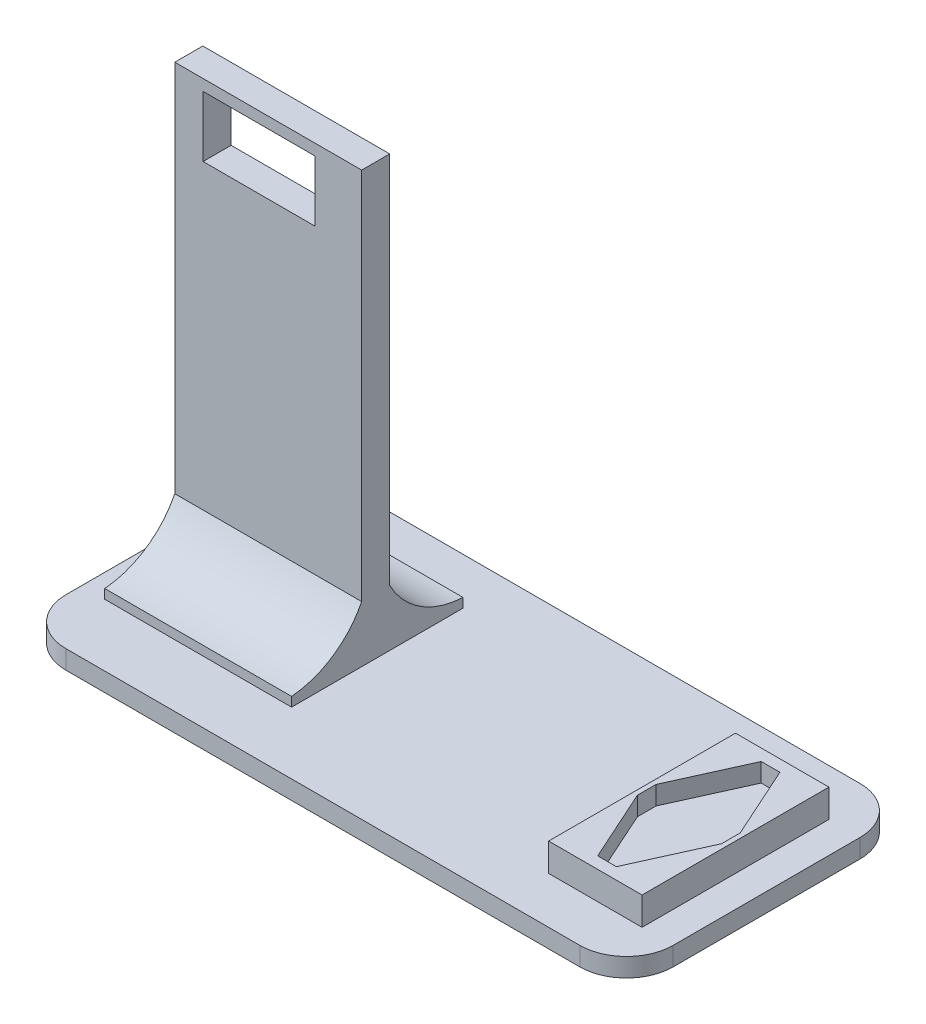
ISO-10303-21;
HEADER;
FILE_DESCRIPTION(('STEP AP214'),'2;1');
FILE_NAME('part.step','',(''),(''),'','','');
FILE_SCHEMA(('AUTOMOTIVE_DESIGN { 1 0 10303 214 1 1 1 1 }'));
ENDSEC;
DATA;
#1=APPLICATION_CONTEXT('core data for automotive mechanical design processes');
#2=APPLICATION_PROTOCOL_DEFINITION('international standard','automotive_design',2000,#1);
#3=PRODUCT_CONTEXT('',#1,'mechanical');
#4=PRODUCT('Part','Part','',(#3));
#5=PRODUCT_RELATED_PRODUCT_CATEGORY('part','',(#4));
#6=PRODUCT_DEFINITION_FORMATION('','',#4);
#7=PRODUCT_DEFINITION_CONTEXT('part definition',#1,'design');
#8=PRODUCT_DEFINITION('design','',#6,#7);
#9=PRODUCT_DEFINITION_SHAPE('','',#8);
#10=(LENGTH_UNIT() NAMED_UNIT(*) SI_UNIT(.MILLI.,.METRE.));
#11=(NAMED_UNIT(*) PLANE_ANGLE_UNIT() SI_UNIT($,.RADIAN.));
#12=(NAMED_UNIT(*) SI_UNIT($,.STERADIAN.) SOLID_ANGLE_UNIT());
#13=UNCERTAINTY_MEASURE_WITH_UNIT(LENGTH_MEASURE(1.E-05),#10,'distance_accuracy_value','');
#14=(GEOMETRIC_REPRESENTATION_CONTEXT(3) GLOBAL_UNCERTAINTY_ASSIGNED_CONTEXT((#13)) GLOBAL_UNIT_ASSIGNED_CONTEXT((#10,
#11,#12)) REPRESENTATION_CONTEXT('',''));
#15=CARTESIAN_POINT('',(0.,0.,0.));
#16=DIRECTION('',(0.,0.,1.));
#17=DIRECTION('',(1.,0.,0.));
#18=AXIS2_PLACEMENT_3D('',#15,#16,#17);
#19=CARTESIAN_POINT('',(-55.,-4.,-20.));
#20=DIRECTION('',(0.,1.,0.));
#21=DIRECTION('',(0.,0.,1.));
#22=AXIS2_PLACEMENT_3D('',#19,#20,#21);
#23=CYLINDRICAL_SURFACE('',#22,10.);
#24=CARTESIAN_POINT('',(-55.,0.,-20.));
#25=DIRECTION('',(0.,1.,0.));
#26=DIRECTION('',(0.,0.,1.));
#27=AXIS2_PLACEMENT_3D('',#24,#25,#26);
#28=CIRCLE('',#27,10.);
#29=CARTESIAN_POINT('',(-65.,0.,-19.9999999999999));
#30=VERTEX_POINT('',#29);
#31=CARTESIAN_POINT('',(-54.9999999999999,0.,-30.));
#32=VERTEX_POINT('',#31);
#33=EDGE_CURVE('E669',#30,#32,#28,.F.);
#34=ORIENTED_EDGE('',*,*,#33,.T.);
#35=DIRECTION('',(0.,1.,0.));
#36=VECTOR('',#35,1.);
#37=CARTESIAN_POINT('',(-54.9999999999999,-4.,-30.));
#38=LINE('',#37,#36);
#39=CARTESIAN_POINT('',(-54.9999999999999,-4.,-30.));
#40=VERTEX_POINT('',#39);
#41=EDGE_CURVE('E12',#40,#32,#38,.T.);
#42=ORIENTED_EDGE('',*,*,#41,.F.);
#43=CARTESIAN_POINT('',(-55.,-4.,-20.));
#44=DIRECTION('',(0.,1.,0.));
#45=DIRECTION('',(0.,0.,1.));
#46=AXIS2_PLACEMENT_3D('',#43,#44,#45);
#47=CIRCLE('',#46,10.);
#48=CARTESIAN_POINT('',(-65.,-4.,-19.9999999999999));
#49=VERTEX_POINT('',#48);
#50=EDGE_CURVE('E647',#49,#40,#47,.F.);
#51=ORIENTED_EDGE('',*,*,#50,.F.);
#52=DIRECTION('',(0.,1.,0.));
#53=VECTOR('',#52,1.);
#54=CARTESIAN_POINT('',(-65.,-4.,-19.9999999999999));
#55=LINE('',#54,#53);
#56=EDGE_CURVE('E668',#49,#30,#55,.T.);
#57=ORIENTED_EDGE('',*,*,#56,.T.);
#58=EDGE_LOOP('',(#34,#42,#51,#57));
#59=FACE_BOUND('',#58,.T.);
#60=ADVANCED_FACE('F54',(#59),#23,.T.);
#61=CARTESIAN_POINT('',(0.,-4.,-30.));
#62=DIRECTION('',(0.,0.,1.));
#63=DIRECTION('',(1.,0.,0.));
#64=AXIS2_PLACEMENT_3D('',#61,#62,#63);
#65=PLANE('',#64);
#66=DIRECTION('',(1.,0.,0.));
#67=VECTOR('',#66,1.);
#68=CARTESIAN_POINT('',(0.,0.,-30.));
#69=LINE('',#68,#67);
#70=CARTESIAN_POINT('',(54.9999999999999,0.,-30.));
#71=VERTEX_POINT('',#70);
#72=EDGE_CURVE('E651',#32,#71,#69,.T.);
#73=ORIENTED_EDGE('',*,*,#72,.T.);
#74=DIRECTION('',(0.,1.,0.));
#75=VECTOR('',#74,1.);
#76=CARTESIAN_POINT('',(54.9999999999999,-4.,-30.));
#77=LINE('',#76,#75);
#78=CARTESIAN_POINT('',(54.9999999999999,-4.,-30.));
#79=VERTEX_POINT('',#78);
#80=EDGE_CURVE('E64',#79,#71,#77,.T.);
#81=ORIENTED_EDGE('',*,*,#80,.F.);
#82=DIRECTION('',(1.,0.,0.));
#83=VECTOR('',#82,1.);
#84=CARTESIAN_POINT('',(0.,-4.,-30.));
#85=LINE('',#84,#83);
#86=EDGE_CURVE('E666',#40,#79,#85,.T.);
#87=ORIENTED_EDGE('',*,*,#86,.F.);
#88=ORIENTED_EDGE('',*,*,#41,.T.);
#89=EDGE_LOOP('',(#73,#81,#87,#88));
#90=FACE_BOUND('',#89,.T.);
#91=ADVANCED_FACE('F820',(#90),#65,.F.);
#92=CARTESIAN_POINT('',(55.,-4.,-20.));
#93=DIRECTION('',(0.,1.,0.));
#94=DIRECTION('',(0.,0.,1.));
#95=AXIS2_PLACEMENT_3D('',#92,#93,#94);
#96=CYLINDRICAL_SURFACE('',#95,10.);
#97=CARTESIAN_POINT('',(55.,0.,-20.));
#98=DIRECTION('',(0.,1.,0.));
#99=DIRECTION('',(0.,0.,1.));
#100=AXIS2_PLACEMENT_3D('',#97,#98,#99);
#101=CIRCLE('',#100,10.);
#102=CARTESIAN_POINT('',(65.,0.,-19.9999999999999));
#103=VERTEX_POINT('',#102);
#104=EDGE_CURVE('E685',#71,#103,#101,.F.);
#105=ORIENTED_EDGE('',*,*,#104,.T.);
#106=DIRECTION('',(0.,1.,0.));
#107=VECTOR('',#106,1.);
#108=CARTESIAN_POINT('',(65.,-4.,-19.9999999999999));
#109=LINE('',#108,#107);
#110=CARTESIAN_POINT('',(65.,-4.,-19.9999999999999));
#111=VERTEX_POINT('',#110);
#112=EDGE_CURVE('E691',#111,#103,#109,.T.);
#113=ORIENTED_EDGE('',*,*,#112,.F.);
#114=CARTESIAN_POINT('',(55.,-4.,-20.));
#115=DIRECTION('',(0.,1.,0.));
#116=DIRECTION('',(0.,0.,1.));
#117=AXIS2_PLACEMENT_3D('',#114,#115,#116);
#118=CIRCLE('',#117,10.);
#119=EDGE_CURVE('E664',#79,#111,#118,.F.);
#120=ORIENTED_EDGE('',*,*,#119,.F.);
#121=ORIENTED_EDGE('',*,*,#80,.T.);
#122=EDGE_LOOP('',(#105,#113,#120,#121));
#123=FACE_BOUND('',#122,.T.);
#124=ADVANCED_FACE('F825',(#123),#96,.T.);
#125=CARTESIAN_POINT('',(65.,-4.,0.));
#126=DIRECTION('',(1.,0.,0.));
#127=DIRECTION('',(0.,0.,-1.));
#128=AXIS2_PLACEMENT_3D('',#125,#126,#127);
#129=PLANE('',#128);
#130=DIRECTION('',(0.,0.,-1.));
#131=VECTOR('',#130,1.);
#132=CARTESIAN_POINT('',(65.,0.,0.));
#133=LINE('',#132,#131);
#134=CARTESIAN_POINT('',(65.,0.,19.9999999999999));
#135=VERTEX_POINT('',#134);
#136=EDGE_CURVE('E682',#135,#103,#133,.T.);
#137=ORIENTED_EDGE('',*,*,#136,.F.);
#138=DIRECTION('',(0.,1.,0.));
#139=VECTOR('',#138,1.);
#140=CARTESIAN_POINT('',(65.,-4.,19.9999999999999));
#141=LINE('',#140,#139);
#142=CARTESIAN_POINT('',(65.,-4.,19.9999999999999));
#143=VERTEX_POINT('',#142);
#144=EDGE_CURVE('E693',#143,#135,#141,.T.);
#145=ORIENTED_EDGE('',*,*,#144,.F.);
#146=DIRECTION('',(0.,0.,-1.));
#147=VECTOR('',#146,1.);
#148=CARTESIAN_POINT('',(65.,-4.,0.));
#149=LINE('',#148,#147);
#150=EDGE_CURVE('E661',#143,#111,#149,.T.);
#151=ORIENTED_EDGE('',*,*,#150,.T.);
#152=ORIENTED_EDGE('',*,*,#112,.T.);
#153=EDGE_LOOP('',(#137,#145,#151,#152));
#154=FACE_BOUND('',#153,.T.);
#155=ADVANCED_FACE('F855',(#154),#129,.T.);
#156=CARTESIAN_POINT('',(55.,-4.,20.));
#157=DIRECTION('',(0.,1.,0.));
#158=DIRECTION('',(0.,0.,1.));
#159=AXIS2_PLACEMENT_3D('',#156,#157,#158);
#160=CYLINDRICAL_SURFACE('',#159,10.);
#161=CARTESIAN_POINT('',(55.,0.,20.));
#162=DIRECTION('',(0.,1.,0.));
#163=DIRECTION('',(0.,0.,1.));
#164=AXIS2_PLACEMENT_3D('',#161,#162,#163);
#165=CIRCLE('',#164,10.);
#166=CARTESIAN_POINT('',(54.9999999999999,0.,30.));
#167=VERTEX_POINT('',#166);
#168=EDGE_CURVE('E679',#167,#135,#165,.T.);
#169=ORIENTED_EDGE('',*,*,#168,.F.);
#170=DIRECTION('',(0.,1.,0.));
#171=VECTOR('',#170,1.);
#172=CARTESIAN_POINT('',(54.9999999999999,-4.,30.));
#173=LINE('',#172,#171);
#174=CARTESIAN_POINT('',(54.9999999999999,-4.,30.));
#175=VERTEX_POINT('',#174);
#176=EDGE_CURVE('E695',#175,#167,#173,.T.);
#177=ORIENTED_EDGE('',*,*,#176,.F.);
#178=CARTESIAN_POINT('',(55.,-4.,20.));
#179=DIRECTION('',(0.,1.,0.));
#180=DIRECTION('',(0.,0.,1.));
#181=AXIS2_PLACEMENT_3D('',#178,#179,#180);
#182=CIRCLE('',#181,10.);
#183=EDGE_CURVE('E658',#175,#143,#182,.T.);
#184=ORIENTED_EDGE('',*,*,#183,.T.);
#185=ORIENTED_EDGE('',*,*,#144,.T.);
#186=EDGE_LOOP('',(#169,#177,#184,#185));
#187=FACE_BOUND('',#186,.T.);
#188=ADVANCED_FACE('F852',(#187),#160,.T.);
#189=CARTESIAN_POINT('',(0.,-4.,30.));
#190=DIRECTION('',(0.,0.,1.));
#191=DIRECTION('',(1.,0.,0.));
#192=AXIS2_PLACEMENT_3D('',#189,#190,#191);
#193=PLANE('',#192);
#194=DIRECTION('',(1.,0.,0.));
#195=VECTOR('',#194,1.);
#196=CARTESIAN_POINT('',(0.,0.,30.));
#197=LINE('',#196,#195);
#198=CARTESIAN_POINT('',(-54.9999999999999,0.,30.));
#199=VERTEX_POINT('',#198);
#200=EDGE_CURVE('E676',#199,#167,#197,.T.);
#201=ORIENTED_EDGE('',*,*,#200,.F.);
#202=DIRECTION('',(0.,1.,0.));
#203=VECTOR('',#202,1.);
#204=CARTESIAN_POINT('',(-54.9999999999999,-4.,30.));
#205=LINE('',#204,#203);
#206=CARTESIAN_POINT('',(-54.9999999999999,-4.,30.));
#207=VERTEX_POINT('',#206);
#208=EDGE_CURVE('E697',#207,#199,#205,.T.);
#209=ORIENTED_EDGE('',*,*,#208,.F.);
#210=DIRECTION('',(1.,0.,0.));
#211=VECTOR('',#210,1.);
#212=CARTESIAN_POINT('',(0.,-4.,30.));
#213=LINE('',#212,#211);
#214=EDGE_CURVE('E655',#207,#175,#213,.T.);
#215=ORIENTED_EDGE('',*,*,#214,.T.);
#216=ORIENTED_EDGE('',*,*,#176,.T.);
#217=EDGE_LOOP('',(#201,#209,#215,#216));
#218=FACE_BOUND('',#217,.T.);
#219=ADVANCED_FACE('F848',(#218),#193,.T.);
#220=CARTESIAN_POINT('',(-55.,-4.,20.));
#221=DIRECTION('',(0.,1.,0.));
#222=DIRECTION('',(0.,0.,1.));
#223=AXIS2_PLACEMENT_3D('',#220,#221,#222);
#224=CYLINDRICAL_SURFACE('',#223,10.);
#225=CARTESIAN_POINT('',(-55.,0.,20.));
#226=DIRECTION('',(0.,1.,0.));
#227=DIRECTION('',(0.,0.,1.));
#228=AXIS2_PLACEMENT_3D('',#225,#226,#227);
#229=CIRCLE('',#228,10.);
#230=CARTESIAN_POINT('',(-65.,0.,19.9999999999999));
#231=VERTEX_POINT('',#230);
#232=EDGE_CURVE('E674',#199,#231,#229,.F.);
#233=ORIENTED_EDGE('',*,*,#232,.T.);
#234=DIRECTION('',(0.,1.,0.));
#235=VECTOR('',#234,1.);
#236=CARTESIAN_POINT('',(-65.,-4.,19.9999999999999));
#237=LINE('',#236,#235);
#238=CARTESIAN_POINT('',(-65.,-4.,19.9999999999999));
#239=VERTEX_POINT('',#238);
#240=EDGE_CURVE('E699',#239,#231,#237,.T.);
#241=ORIENTED_EDGE('',*,*,#240,.F.);
#242=CARTESIAN_POINT('',(-55.,-4.,20.));
#243=DIRECTION('',(0.,1.,0.));
#244=DIRECTION('',(0.,0.,1.));
#245=AXIS2_PLACEMENT_3D('',#242,#243,#244);
#246=CIRCLE('',#245,10.);
#247=EDGE_CURVE('E653',#207,#239,#246,.F.);
#248=ORIENTED_EDGE('',*,*,#247,.F.);
#249=ORIENTED_EDGE('',*,*,#208,.T.);
#250=EDGE_LOOP('',(#233,#241,#248,#249));
#251=FACE_BOUND('',#250,.T.);
#252=ADVANCED_FACE('F845',(#251),#224,.T.);
#253=CARTESIAN_POINT('',(-65.,-4.,0.));
#254=DIRECTION('',(1.,0.,0.));
#255=DIRECTION('',(0.,0.,-1.));
#256=AXIS2_PLACEMENT_3D('',#253,#254,#255);
#257=PLANE('',#256);
#258=DIRECTION('',(0.,0.,-1.));
#259=VECTOR('',#258,1.);
#260=CARTESIAN_POINT('',(-65.,0.,0.));
#261=LINE('',#260,#259);
#262=EDGE_CURVE('E672',#231,#30,#261,.T.);
#263=ORIENTED_EDGE('',*,*,#262,.T.);
#264=ORIENTED_EDGE('',*,*,#56,.F.);
#265=DIRECTION('',(0.,0.,-1.));
#266=VECTOR('',#265,1.);
#267=CARTESIAN_POINT('',(-65.,-4.,0.));
#268=LINE('',#267,#266);
#269=EDGE_CURVE('E650',#239,#49,#268,.T.);
#270=ORIENTED_EDGE('',*,*,#269,.F.);
#271=ORIENTED_EDGE('',*,*,#240,.T.);
#272=EDGE_LOOP('',(#263,#264,#270,#271));
#273=FACE_BOUND('',#272,.T.);
#274=ADVANCED_FACE('F843',(#273),#257,.F.);
#275=CARTESIAN_POINT('',(0.,-4.,0.));
#276=DIRECTION('',(0.,1.,0.));
#277=DIRECTION('',(0.,0.,1.));
#278=AXIS2_PLACEMENT_3D('',#275,#276,#277);
#279=PLANE('',#278);
#280=ORIENTED_EDGE('',*,*,#50,.T.);
#281=ORIENTED_EDGE('',*,*,#86,.T.);
#282=ORIENTED_EDGE('',*,*,#119,.T.);
#283=ORIENTED_EDGE('',*,*,#150,.F.);
#284=ORIENTED_EDGE('',*,*,#183,.F.);
#285=ORIENTED_EDGE('',*,*,#214,.F.);
#286=ORIENTED_EDGE('',*,*,#247,.T.);
#287=ORIENTED_EDGE('',*,*,#269,.T.);
#288=EDGE_LOOP('',(#280,#281,#282,#283,#284,#285,#286,#287));
#289=FACE_BOUND('',#288,.T.);
#290=ADVANCED_FACE('F556',(#289),#279,.F.);
#291=CARTESIAN_POINT('',(0.,0.,0.));
#292=DIRECTION('',(0.,1.,0.));
#293=DIRECTION('',(0.,0.,1.));
#294=AXIS2_PLACEMENT_3D('',#291,#292,#293);
#295=PLANE('',#294);
#296=DIRECTION('',(0.,0.,1.));
#297=VECTOR('',#296,1.);
#298=CARTESIAN_POINT('',(38.3333333333334,0.,-20.));
#299=LINE('',#298,#297);
#300=CARTESIAN_POINT('',(38.3333333333334,0.,-20.));
#301=VERTEX_POINT('',#300);
#302=CARTESIAN_POINT('',(38.3333333333334,0.,20.));
#303=VERTEX_POINT('',#302);
#304=EDGE_CURVE('E610',#301,#303,#299,.T.);
#305=ORIENTED_EDGE('',*,*,#304,.F.);
#306=DIRECTION('',(-1.,0.,0.));
#307=VECTOR('',#306,1.);
#308=CARTESIAN_POINT('',(58.3333333333334,0.,-20.));
#309=LINE('',#308,#307);
#310=CARTESIAN_POINT('',(58.3333333333334,0.,-20.));
#311=VERTEX_POINT('',#310);
#312=EDGE_CURVE('E624',#311,#301,#309,.T.);
#313=ORIENTED_EDGE('',*,*,#312,.F.);
#314=DIRECTION('',(0.,0.,-1.));
#315=VECTOR('',#314,1.);
#316=CARTESIAN_POINT('',(58.3333333333334,0.,20.));
#317=LINE('',#316,#315);
#318=CARTESIAN_POINT('',(58.3333333333334,0.,20.));
#319=VERTEX_POINT('',#318);
#320=EDGE_CURVE('E621',#319,#311,#317,.T.);
#321=ORIENTED_EDGE('',*,*,#320,.F.);
#322=DIRECTION('',(1.,0.,0.));
#323=VECTOR('',#322,1.);
#324=CARTESIAN_POINT('',(38.3333333333334,0.,20.));
#325=LINE('',#324,#323);
#326=EDGE_CURVE('E618',#303,#319,#325,.T.);
#327=ORIENTED_EDGE('',*,*,#326,.F.);
#328=EDGE_LOOP('',(#305,#313,#321,#327));
#329=FACE_BOUND('',#328,.T.);
#330=DIRECTION('',(0.,0.,1.));
#331=VECTOR('',#330,1.);
#332=CARTESIAN_POINT('',(-60.,0.,-20.));
#333=LINE('',#332,#331);
#334=CARTESIAN_POINT('',(-60.,0.,-20.));
#335=VERTEX_POINT('',#334);
#336=CARTESIAN_POINT('',(-60.,0.,16.696145015894));
#337=VERTEX_POINT('',#336);
#338=EDGE_CURVE('E636',#335,#337,#333,.T.);
#339=ORIENTED_EDGE('',*,*,#338,.F.);
#340=DIRECTION('',(-1.,0.,0.));
#341=VECTOR('',#340,1.);
#342=CARTESIAN_POINT('',(-20.,0.,-20.));
#343=LINE('',#342,#341);
#344=CARTESIAN_POINT('',(-20.,0.,-20.));
#345=VERTEX_POINT('',#344);
#346=EDGE_CURVE('E644',#345,#335,#343,.T.);
#347=ORIENTED_EDGE('',*,*,#346,.F.);
#348=DIRECTION('',(0.,0.,-1.));
#349=VECTOR('',#348,1.);
#350=CARTESIAN_POINT('',(-20.,0.,16.696145015894));
#351=LINE('',#350,#349);
#352=CARTESIAN_POINT('',(-20.,0.,16.696145015894));
#353=VERTEX_POINT('',#352);
#354=EDGE_CURVE('E641',#353,#345,#351,.T.);
#355=ORIENTED_EDGE('',*,*,#354,.F.);
#356=DIRECTION('',(1.,0.,0.));
#357=VECTOR('',#356,1.);
#358=CARTESIAN_POINT('',(-60.,0.,16.696145015894));
#359=LINE('',#358,#357);
#360=EDGE_CURVE('E638',#337,#353,#359,.T.);
#361=ORIENTED_EDGE('',*,*,#360,.F.);
#362=EDGE_LOOP('',(#339,#347,#355,#361));
#363=FACE_BOUND('',#362,.T.);
#364=ORIENTED_EDGE('',*,*,#33,.F.);
#365=ORIENTED_EDGE('',*,*,#262,.F.);
#366=ORIENTED_EDGE('',*,*,#232,.F.);
#367=ORIENTED_EDGE('',*,*,#200,.T.);
#368=ORIENTED_EDGE('',*,*,#168,.T.);
#369=ORIENTED_EDGE('',*,*,#136,.T.);
#370=ORIENTED_EDGE('',*,*,#104,.F.);
#371=ORIENTED_EDGE('',*,*,#72,.F.);
#372=EDGE_LOOP('',(#364,#365,#366,#367,#368,#369,#370,#371));
#373=FACE_BOUND('',#372,.T.);
#374=ADVANCED_FACE('F553',(#329,#363,#373),#295,.T.);
#375=CARTESIAN_POINT('',(-60.,0.,-20.));
#376=DIRECTION('',(-1.,0.,0.));
#377=DIRECTION('',(0.,0.,1.));
#378=AXIS2_PLACEMENT_3D('',#375,#376,#377);
#379=PLANE('',#378);
#380=DIRECTION('',(0.,1.,0.));
#381=VECTOR('',#380,1.);
#382=CARTESIAN_POINT('',(-60.,0.,16.696145015894));
#383=LINE('',#382,#381);
#384=CARTESIAN_POINT('',(-60.,2.,16.696145015894));
#385=VERTEX_POINT('',#384);
#386=EDGE_CURVE('E646',#337,#385,#383,.T.);
#387=ORIENTED_EDGE('',*,*,#386,.T.);
#388=CARTESIAN_POINT('',(-60.,20.3091601355322,18.1096370032893));
#389=DIRECTION('',(-1.,0.,0.));
#390=DIRECTION('',(0.,0.,1.));
#391=AXIS2_PLACEMENT_3D('',#388,#389,#390);
#392=CIRCLE('',#391,18.3636408281961);
#393=CARTESIAN_POINT('',(-60.,12.0738346867899,1.696145015894));
#394=VERTEX_POINT('',#393);
#395=EDGE_CURVE('E410',#385,#394,#392,.F.);
#396=ORIENTED_EDGE('',*,*,#395,.T.);
#397=DIRECTION('',(0.,1.,0.));
#398=VECTOR('',#397,1.);
#399=CARTESIAN_POINT('',(-60.,12.0738346867899,1.69614501589401));
#400=LINE('',#399,#398);
#401=CARTESIAN_POINT('',(-60.,92.0738346867899,1.69614501589401));
#402=VERTEX_POINT('',#401);
#403=EDGE_CURVE('E406',#394,#402,#400,.T.);
#404=ORIENTED_EDGE('',*,*,#403,.T.);
#405=DIRECTION('',(0.,0.,1.));
#406=VECTOR('',#405,1.);
#407=CARTESIAN_POINT('',(-60.,92.0738346867899,-4.303854984106));
#408=LINE('',#407,#406);
#409=CARTESIAN_POINT('',(-60.,92.0738346867899,-4.303854984106));
#410=VERTEX_POINT('',#409);
#411=EDGE_CURVE('E374',#410,#402,#408,.T.);
#412=ORIENTED_EDGE('',*,*,#411,.F.);
#413=DIRECTION('',(0.,1.,0.));
#414=VECTOR('',#413,1.);
#415=CARTESIAN_POINT('',(-60.,12.0738346867899,-4.303854984106));
#416=LINE('',#415,#414);
#417=CARTESIAN_POINT('',(-60.,12.0738346867899,-4.303854984106));
#418=VERTEX_POINT('',#417);
#419=EDGE_CURVE('E411',#418,#410,#416,.T.);
#420=ORIENTED_EDGE('',*,*,#419,.F.);
#421=CARTESIAN_POINT('',(-60.,20.6215250256858,-20.8705709511775));
#422=DIRECTION('',(-1.,0.,0.));
#423=DIRECTION('',(0.,-0.998908970075112,0.0466997805506539));
#424=AXIS2_PLACEMENT_3D('',#421,#422,#423);
#425=CIRCLE('',#424,18.6418638570095);
#426=CARTESIAN_POINT('',(-60.,2.,-20.));
#427=VERTEX_POINT('',#426);
#428=EDGE_CURVE('E471',#427,#418,#425,.T.);
#429=ORIENTED_EDGE('',*,*,#428,.F.);
#430=DIRECTION('',(0.,1.,0.));
#431=VECTOR('',#430,1.);
#432=CARTESIAN_POINT('',(-60.,0.,-20.));
#433=LINE('',#432,#431);
#434=EDGE_CURVE('E481',#335,#427,#433,.T.);
#435=ORIENTED_EDGE('',*,*,#434,.F.);
#436=ORIENTED_EDGE('',*,*,#338,.T.);
#437=EDGE_LOOP('',(#387,#396,#404,#412,#420,#429,#435,#436));
#438=FACE_BOUND('',#437,.T.);
#439=ADVANCED_FACE('F534',(#438),#379,.T.);
#440=CARTESIAN_POINT('',(-20.,0.,-20.));
#441=DIRECTION('',(0.,0.,-1.));
#442=DIRECTION('',(-1.,0.,0.));
#443=AXIS2_PLACEMENT_3D('',#440,#441,#442);
#444=PLANE('',#443);
#445=DIRECTION('',(-1.,0.,0.));
#446=VECTOR('',#445,1.);
#447=CARTESIAN_POINT('',(-60.,1.99999999999999,-20.));
#448=LINE('',#447,#446);
#449=CARTESIAN_POINT('',(-20.,2.,-20.));
#450=VERTEX_POINT('',#449);
#451=EDGE_CURVE('E517',#450,#427,#448,.T.);
#452=ORIENTED_EDGE('',*,*,#451,.F.);
#453=DIRECTION('',(0.,1.,0.));
#454=VECTOR('',#453,1.);
#455=CARTESIAN_POINT('',(-20.,0.,-20.));
#456=LINE('',#455,#454);
#457=EDGE_CURVE('E479',#345,#450,#456,.T.);
#458=ORIENTED_EDGE('',*,*,#457,.F.);
#459=ORIENTED_EDGE('',*,*,#346,.T.);
#460=ORIENTED_EDGE('',*,*,#434,.T.);
#461=EDGE_LOOP('',(#452,#458,#459,#460));
#462=FACE_BOUND('',#461,.T.);
#463=ADVANCED_FACE('F552',(#462),#444,.T.);
#464=CARTESIAN_POINT('',(-20.,0.,16.696145015894));
#465=DIRECTION('',(1.,0.,0.));
#466=DIRECTION('',(0.,0.,-1.));
#467=AXIS2_PLACEMENT_3D('',#464,#465,#466);
#468=PLANE('',#467);
#469=ORIENTED_EDGE('',*,*,#457,.T.);
#470=CARTESIAN_POINT('',(-20.,20.6215250256858,-20.8705709511775));
#471=DIRECTION('',(1.,0.,0.));
#472=DIRECTION('',(0.,0.,-1.));
#473=AXIS2_PLACEMENT_3D('',#470,#471,#472);
#474=CIRCLE('',#473,18.6418638570095);
#475=CARTESIAN_POINT('',(-20.,12.0738346867899,-4.303854984106));
#476=VERTEX_POINT('',#475);
#477=EDGE_CURVE('E391',#450,#476,#474,.F.);
#478=ORIENTED_EDGE('',*,*,#477,.T.);
#479=DIRECTION('',(0.,1.,0.));
#480=VECTOR('',#479,1.);
#481=CARTESIAN_POINT('',(-20.,12.0738346867899,-4.303854984106));
#482=LINE('',#481,#480);
#483=CARTESIAN_POINT('',(-20.,92.0738346867899,-4.303854984106));
#484=VERTEX_POINT('',#483);
#485=EDGE_CURVE('E392',#476,#484,#482,.T.);
#486=ORIENTED_EDGE('',*,*,#485,.T.);
#487=DIRECTION('',(0.,0.,-1.));
#488=VECTOR('',#487,1.);
#489=CARTESIAN_POINT('',(-20.,92.0738346867899,1.69614501589401));
#490=LINE('',#489,#488);
#491=CARTESIAN_POINT('',(-20.,92.0738346867899,1.69614501589401));
#492=VERTEX_POINT('',#491);
#493=EDGE_CURVE('E393',#492,#484,#490,.T.);
#494=ORIENTED_EDGE('',*,*,#493,.F.);
#495=DIRECTION('',(0.,1.,0.));
#496=VECTOR('',#495,1.);
#497=CARTESIAN_POINT('',(-20.,12.0738346867899,1.696145015894));
#498=LINE('',#497,#496);
#499=CARTESIAN_POINT('',(-20.,12.0738346867899,1.696145015894));
#500=VERTEX_POINT('',#499);
#501=EDGE_CURVE('E387',#500,#492,#498,.T.);
#502=ORIENTED_EDGE('',*,*,#501,.F.);
#503=CARTESIAN_POINT('',(-20.,2.,16.696145015894));
#504=CARTESIAN_POINT('',(-20.,2.24247288644167,13.5553596902531));
#505=CARTESIAN_POINT('',(-20.,3.3090550744341,10.4851632265817));
#506=CARTESIAN_POINT('',(-20.,6.81976347991217,5.25769744820924));
#507=CARTESIAN_POINT('',(-20.,9.25823558833193,3.10884713565689));
#508=CARTESIAN_POINT('',(-20.,12.0738346867899,1.696145015894));
#509=B_SPLINE_CURVE_WITH_KNOTS('',3,(#503,#504,#505,#506,#507,#508),.UNSPECIFIED.,.F.,.F.,(4,2,
4),(0.,0.5,1.),.UNSPECIFIED.);
#510=CARTESIAN_POINT('',(-20.,2.,16.696145015894));
#511=VERTEX_POINT('',#510);
#512=EDGE_CURVE('E486',#511,#500,#509,.T.);
#513=ORIENTED_EDGE('',*,*,#512,.F.);
#514=DIRECTION('',(0.,1.,0.));
#515=VECTOR('',#514,1.);
#516=CARTESIAN_POINT('',(-20.,0.,16.696145015894));
#517=LINE('',#516,#515);
#518=EDGE_CURVE('E482',#353,#511,#517,.T.);
#519=ORIENTED_EDGE('',*,*,#518,.F.);
#520=ORIENTED_EDGE('',*,*,#354,.T.);
#521=EDGE_LOOP('',(#469,#478,#486,#494,#502,#513,#519,#520));
#522=FACE_BOUND('',#521,.T.);
#523=ADVANCED_FACE('F747',(#522),#468,.T.);
#524=CARTESIAN_POINT('',(-60.,0.,16.696145015894));
#525=DIRECTION('',(0.,0.,1.));
#526=DIRECTION('',(1.,0.,0.));
#527=AXIS2_PLACEMENT_3D('',#524,#525,#526);
#528=PLANE('',#527);
#529=DIRECTION('',(1.,0.,0.));
#530=VECTOR('',#529,1.);
#531=CARTESIAN_POINT('',(-20.,1.99999999999999,16.696145015894));
#532=LINE('',#531,#530);
#533=EDGE_CURVE('E630',#385,#511,#532,.T.);
#534=ORIENTED_EDGE('',*,*,#533,.F.);
#535=ORIENTED_EDGE('',*,*,#386,.F.);
#536=ORIENTED_EDGE('',*,*,#360,.T.);
#537=ORIENTED_EDGE('',*,*,#518,.T.);
#538=EDGE_LOOP('',(#534,#535,#536,#537));
#539=FACE_BOUND('',#538,.T.);
#540=ADVANCED_FACE('F554',(#539),#528,.T.);
#541=CARTESIAN_POINT('',(38.3333333333334,0.,-20.));
#542=DIRECTION('',(-1.,0.,0.));
#543=DIRECTION('',(0.,0.,1.));
#544=AXIS2_PLACEMENT_3D('',#541,#542,#543);
#545=PLANE('',#544);
#546=DIRECTION('',(0.,1.,0.));
#547=VECTOR('',#546,1.);
#548=CARTESIAN_POINT('',(38.3333333333334,0.,20.));
#549=LINE('',#548,#547);
#550=CARTESIAN_POINT('',(38.3333333333334,6.,20.));
#551=VERTEX_POINT('',#550);
#552=EDGE_CURVE('E627',#303,#551,#549,.T.);
#553=ORIENTED_EDGE('',*,*,#552,.T.);
#554=DIRECTION('',(0.,0.,-1.));
#555=VECTOR('',#554,1.);
#556=CARTESIAN_POINT('',(38.3333333333334,6.,0.));
#557=LINE('',#556,#555);
#558=CARTESIAN_POINT('',(38.3333333333334,6.,-20.));
#559=VERTEX_POINT('',#558);
#560=EDGE_CURVE('E307',#551,#559,#557,.T.);
#561=ORIENTED_EDGE('',*,*,#560,.T.);
#562=DIRECTION('',(0.,1.,0.));
#563=VECTOR('',#562,1.);
#564=CARTESIAN_POINT('',(38.3333333333334,0.,-20.));
#565=LINE('',#564,#563);
#566=EDGE_CURVE('E628',#301,#559,#565,.T.);
#567=ORIENTED_EDGE('',*,*,#566,.F.);
#568=ORIENTED_EDGE('',*,*,#304,.T.);
#569=EDGE_LOOP('',(#553,#561,#567,#568));
#570=FACE_BOUND('',#569,.T.);
#571=ADVANCED_FACE('F804',(#570),#545,.T.);
#572=CARTESIAN_POINT('',(58.3333333333334,0.,-20.));
#573=DIRECTION('',(0.,0.,-1.));
#574=DIRECTION('',(-1.,0.,0.));
#575=AXIS2_PLACEMENT_3D('',#572,#573,#574);
#576=PLANE('',#575);
#577=ORIENTED_EDGE('',*,*,#566,.T.);
#578=DIRECTION('',(1.,0.,0.));
#579=VECTOR('',#578,1.);
#580=CARTESIAN_POINT('',(0.,6.,-20.));
#581=LINE('',#580,#579);
#582=CARTESIAN_POINT('',(58.3333333333334,6.,-20.));
#583=VERTEX_POINT('',#582);
#584=EDGE_CURVE('E316',#559,#583,#581,.T.);
#585=ORIENTED_EDGE('',*,*,#584,.T.);
#586=DIRECTION('',(0.,1.,0.));
#587=VECTOR('',#586,1.);
#588=CARTESIAN_POINT('',(58.3333333333334,0.,-20.));
#589=LINE('',#588,#587);
#590=EDGE_CURVE('E631',#311,#583,#589,.T.);
#591=ORIENTED_EDGE('',*,*,#590,.F.);
#592=ORIENTED_EDGE('',*,*,#312,.T.);
#593=EDGE_LOOP('',(#577,#585,#591,#592));
#594=FACE_BOUND('',#593,.T.);
#595=ADVANCED_FACE('F807',(#594),#576,.T.);
#596=CARTESIAN_POINT('',(58.3333333333334,0.,20.));
#597=DIRECTION('',(1.,0.,0.));
#598=DIRECTION('',(0.,0.,-1.));
#599=AXIS2_PLACEMENT_3D('',#596,#597,#598);
#600=PLANE('',#599);
#601=ORIENTED_EDGE('',*,*,#590,.T.);
#602=DIRECTION('',(0.,0.,1.));
#603=VECTOR('',#602,1.);
#604=CARTESIAN_POINT('',(58.3333333333334,6.,0.));
#605=LINE('',#604,#603);
#606=CARTESIAN_POINT('',(58.3333333333334,6.,20.));
#607=VERTEX_POINT('',#606);
#608=EDGE_CURVE('E313',#583,#607,#605,.T.);
#609=ORIENTED_EDGE('',*,*,#608,.T.);
#610=DIRECTION('',(0.,1.,0.));
#611=VECTOR('',#610,1.);
#612=CARTESIAN_POINT('',(58.3333333333334,0.,20.));
#613=LINE('',#612,#611);
#614=EDGE_CURVE('E633',#319,#607,#613,.T.);
#615=ORIENTED_EDGE('',*,*,#614,.F.);
#616=ORIENTED_EDGE('',*,*,#320,.T.);
#617=EDGE_LOOP('',(#601,#609,#615,#616));
#618=FACE_BOUND('',#617,.T.);
#619=ADVANCED_FACE('F811',(#618),#600,.T.);
#620=CARTESIAN_POINT('',(38.3333333333334,0.,20.));
#621=DIRECTION('',(0.,0.,1.));
#622=DIRECTION('',(1.,0.,0.));
#623=AXIS2_PLACEMENT_3D('',#620,#621,#622);
#624=PLANE('',#623);
#625=ORIENTED_EDGE('',*,*,#614,.T.);
#626=DIRECTION('',(-1.,0.,0.));
#627=VECTOR('',#626,1.);
#628=CARTESIAN_POINT('',(0.,6.,20.));
#629=LINE('',#628,#627);
#630=EDGE_CURVE('E310',#607,#551,#629,.T.);
#631=ORIENTED_EDGE('',*,*,#630,.T.);
#632=ORIENTED_EDGE('',*,*,#552,.F.);
#633=ORIENTED_EDGE('',*,*,#326,.T.);
#634=EDGE_LOOP('',(#625,#631,#632,#633));
#635=FACE_BOUND('',#634,.T.);
#636=ADVANCED_FACE('F593',(#635),#624,.T.);
#637=CARTESIAN_POINT('',(0.,92.0738346867899,0.));
#638=DIRECTION('',(0.,-1.,0.));
#639=DIRECTION('',(0.,0.,-1.));
#640=AXIS2_PLACEMENT_3D('',#637,#638,#639);
#641=PLANE('',#640);
#642=ORIENTED_EDGE('',*,*,#411,.T.);
#643=DIRECTION('',(-1.,0.,0.));
#644=VECTOR('',#643,1.);
#645=CARTESIAN_POINT('',(-20.,92.0738346867899,1.69614501589401));
#646=LINE('',#645,#644);
#647=EDGE_CURVE('E401',#492,#402,#646,.T.);
#648=ORIENTED_EDGE('',*,*,#647,.F.);
#649=ORIENTED_EDGE('',*,*,#493,.T.);
#650=DIRECTION('',(-1.,0.,0.));
#651=VECTOR('',#650,1.);
#652=CARTESIAN_POINT('',(-20.,92.0738346867899,-4.303854984106));
#653=LINE('',#652,#651);
#654=EDGE_CURVE('E424',#484,#410,#653,.T.);
#655=ORIENTED_EDGE('',*,*,#654,.T.);
#656=EDGE_LOOP('',(#642,#648,#649,#655));
#657=FACE_BOUND('',#656,.T.);
#658=ADVANCED_FACE('F582',(#657),#641,.F.);
#659=CARTESIAN_POINT('',(-60.,12.0738346867899,1.69614501589401));
#660=DIRECTION('',(0.,0.,1.));
#661=DIRECTION('',(1.,0.,0.));
#662=AXIS2_PLACEMENT_3D('',#659,#660,#661);
#663=PLANE('',#662);
#664=DIRECTION('',(-1.,0.,0.));
#665=VECTOR('',#664,1.);
#666=CARTESIAN_POINT('',(-29.9460237428457,89.6864870733457,1.69614501589401));
#667=LINE('',#666,#665);
#668=CARTESIAN_POINT('',(-29.9460237428457,89.6864870733457,1.69614501589401));
#669=VERTEX_POINT('',#668);
#670=CARTESIAN_POINT('',(-53.9460237428457,89.6864870733457,1.69614501589401));
#671=VERTEX_POINT('',#670);
#672=EDGE_CURVE('E80',#669,#671,#667,.T.);
#673=ORIENTED_EDGE('',*,*,#672,.F.);
#674=DIRECTION('',(0.,1.,0.));
#675=VECTOR('',#674,1.);
#676=CARTESIAN_POINT('',(-29.9460237428457,76.6864870733457,1.69614501589401));
#677=LINE('',#676,#675);
#678=CARTESIAN_POINT('',(-29.9460237428457,76.6864870733457,1.69614501589401));
#679=VERTEX_POINT('',#678);
#680=EDGE_CURVE('E353',#679,#669,#677,.T.);
#681=ORIENTED_EDGE('',*,*,#680,.F.);
#682=DIRECTION('',(-1.,0.,0.));
#683=VECTOR('',#682,1.);
#684=CARTESIAN_POINT('',(-29.9460237428457,76.6864870733457,1.69614501589401));
#685=LINE('',#684,#683);
#686=CARTESIAN_POINT('',(-53.9460237428457,76.6864870733457,1.69614501589401));
#687=VERTEX_POINT('',#686);
#688=EDGE_CURVE('E367',#679,#687,#685,.T.);
#689=ORIENTED_EDGE('',*,*,#688,.T.);
#690=DIRECTION('',(0.,-1.,0.));
#691=VECTOR('',#690,1.);
#692=CARTESIAN_POINT('',(-53.9460237428457,89.6864870733457,1.69614501589401));
#693=LINE('',#692,#691);
#694=EDGE_CURVE('E364',#671,#687,#693,.T.);
#695=ORIENTED_EDGE('',*,*,#694,.F.);
#696=EDGE_LOOP('',(#673,#681,#689,#695));
#697=FACE_BOUND('',#696,.T.);
#698=ORIENTED_EDGE('',*,*,#501,.T.);
#699=ORIENTED_EDGE('',*,*,#647,.T.);
#700=ORIENTED_EDGE('',*,*,#403,.F.);
#701=DIRECTION('',(1.,0.,0.));
#702=VECTOR('',#701,1.);
#703=CARTESIAN_POINT('',(-60.,12.0738346867899,1.69614501589401));
#704=LINE('',#703,#702);
#705=EDGE_CURVE('E476',#394,#500,#704,.T.);
#706=ORIENTED_EDGE('',*,*,#705,.T.);
#707=EDGE_LOOP('',(#698,#699,#700,#706));
#708=FACE_BOUND('',#707,.T.);
#709=ADVANCED_FACE('F592',(#697,#708),#663,.T.);
#710=CARTESIAN_POINT('',(-20.,20.3091601355322,18.1096370032893));
#711=DIRECTION('',(1.,0.,0.));
#712=DIRECTION('',(0.,0.,-1.));
#713=AXIS2_PLACEMENT_3D('',#710,#711,#712);
#714=CYLINDRICAL_SURFACE('',#713,18.3636408281961);
#715=ORIENTED_EDGE('',*,*,#512,.T.);
#716=ORIENTED_EDGE('',*,*,#705,.F.);
#717=ORIENTED_EDGE('',*,*,#395,.F.);
#718=ORIENTED_EDGE('',*,*,#533,.T.);
#719=EDGE_LOOP('',(#715,#716,#717,#718));
#720=FACE_BOUND('',#719,.T.);
#721=ADVANCED_FACE('F442',(#720),#714,.F.);
#722=CARTESIAN_POINT('',(-20.,12.0738346867899,-4.303854984106));
#723=DIRECTION('',(0.,0.,-1.));
#724=DIRECTION('',(-1.,0.,0.));
#725=AXIS2_PLACEMENT_3D('',#722,#723,#724);
#726=PLANE('',#725);
#727=DIRECTION('',(-1.,0.,0.));
#728=VECTOR('',#727,1.);
#729=CARTESIAN_POINT('',(-29.9460237428457,89.6864870733457,-4.30385498410599));
#730=LINE('',#729,#728);
#731=CARTESIAN_POINT('',(-29.9460237428457,89.6864870733457,-4.30385498410599));
#732=VERTEX_POINT('',#731);
#733=CARTESIAN_POINT('',(-53.9460237428457,89.6864870733457,-4.30385498410599));
#734=VERTEX_POINT('',#733);
#735=EDGE_CURVE('E349',#732,#734,#730,.T.);
#736=ORIENTED_EDGE('',*,*,#735,.T.);
#737=DIRECTION('',(0.,-1.,0.));
#738=VECTOR('',#737,1.);
#739=CARTESIAN_POINT('',(-53.9460237428457,89.6864870733457,-4.30385498410599));
#740=LINE('',#739,#738);
#741=CARTESIAN_POINT('',(-53.9460237428457,76.6864870733457,-4.303854984106));
#742=VERTEX_POINT('',#741);
#743=EDGE_CURVE('E352',#734,#742,#740,.T.);
#744=ORIENTED_EDGE('',*,*,#743,.T.);
#745=DIRECTION('',(-1.,0.,0.));
#746=VECTOR('',#745,1.);
#747=CARTESIAN_POINT('',(-29.9460237428457,76.6864870733457,-4.30385498410599));
#748=LINE('',#747,#746);
#749=CARTESIAN_POINT('',(-29.9460237428457,76.6864870733457,-4.30385498410599));
#750=VERTEX_POINT('',#749);
#751=EDGE_CURVE('E356',#750,#742,#748,.T.);
#752=ORIENTED_EDGE('',*,*,#751,.F.);
#753=DIRECTION('',(0.,1.,0.));
#754=VECTOR('',#753,1.);
#755=CARTESIAN_POINT('',(-29.9460237428457,76.6864870733457,-4.30385498410599));
#756=LINE('',#755,#754);
#757=EDGE_CURVE('E359',#750,#732,#756,.T.);
#758=ORIENTED_EDGE('',*,*,#757,.T.);
#759=EDGE_LOOP('',(#736,#744,#752,#758));
#760=FACE_BOUND('',#759,.T.);
#761=ORIENTED_EDGE('',*,*,#419,.T.);
#762=ORIENTED_EDGE('',*,*,#654,.F.);
#763=ORIENTED_EDGE('',*,*,#485,.F.);
#764=DIRECTION('',(-1.,0.,0.));
#765=VECTOR('',#764,1.);
#766=CARTESIAN_POINT('',(-20.,12.0738346867899,-4.303854984106));
#767=LINE('',#766,#765);
#768=EDGE_CURVE('E475',#476,#418,#767,.T.);
#769=ORIENTED_EDGE('',*,*,#768,.T.);
#770=EDGE_LOOP('',(#761,#762,#763,#769));
#771=FACE_BOUND('',#770,.T.);
#772=ADVANCED_FACE('F431',(#760,#771),#726,.T.);
#773=CARTESIAN_POINT('',(-60.,20.6215250256858,-20.8705709511775));
#774=DIRECTION('',(-1.,0.,0.));
#775=DIRECTION('',(0.,0.,1.));
#776=AXIS2_PLACEMENT_3D('',#773,#774,#775);
#777=CYLINDRICAL_SURFACE('',#776,18.6418638570095);
#778=ORIENTED_EDGE('',*,*,#428,.T.);
#779=ORIENTED_EDGE('',*,*,#768,.F.);
#780=ORIENTED_EDGE('',*,*,#477,.F.);
#781=ORIENTED_EDGE('',*,*,#451,.T.);
#782=EDGE_LOOP('',(#778,#779,#780,#781));
#783=FACE_BOUND('',#782,.T.);
#784=ADVANCED_FACE('F441',(#783),#777,.F.);
#785=CARTESIAN_POINT('',(-29.9460237428457,89.6864870733457,-4.30385498410599));
#786=DIRECTION('',(0.,1.,0.));
#787=DIRECTION('',(0.,0.,1.));
#788=AXIS2_PLACEMENT_3D('',#785,#786,#787);
#789=PLANE('',#788);
#790=ORIENTED_EDGE('',*,*,#672,.T.);
#791=DIRECTION('',(0.,0.,1.));
#792=VECTOR('',#791,1.);
#793=CARTESIAN_POINT('',(-53.9460237428457,89.6864870733457,-4.30385498410599));
#794=LINE('',#793,#792);
#795=EDGE_CURVE('E362',#734,#671,#794,.T.);
#796=ORIENTED_EDGE('',*,*,#795,.F.);
#797=ORIENTED_EDGE('',*,*,#735,.F.);
#798=DIRECTION('',(0.,0.,1.));
#799=VECTOR('',#798,1.);
#800=CARTESIAN_POINT('',(-29.9460237428457,89.6864870733457,-4.30385498410599));
#801=LINE('',#800,#799);
#802=EDGE_CURVE('E372',#732,#669,#801,.T.);
#803=ORIENTED_EDGE('',*,*,#802,.T.);
#804=EDGE_LOOP('',(#790,#796,#797,#803));
#805=FACE_BOUND('',#804,.T.);
#806=ADVANCED_FACE('F594',(#805),#789,.F.);
#807=CARTESIAN_POINT('',(-29.9460237428457,76.6864870733457,-4.30385498410599));
#808=DIRECTION('',(1.,0.,0.));
#809=DIRECTION('',(0.,0.,-1.));
#810=AXIS2_PLACEMENT_3D('',#807,#808,#809);
#811=PLANE('',#810);
#812=ORIENTED_EDGE('',*,*,#680,.T.);
#813=ORIENTED_EDGE('',*,*,#802,.F.);
#814=ORIENTED_EDGE('',*,*,#757,.F.);
#815=DIRECTION('',(0.,0.,1.));
#816=VECTOR('',#815,1.);
#817=CARTESIAN_POINT('',(-29.9460237428457,76.6864870733457,-4.30385498410599));
#818=LINE('',#817,#816);
#819=EDGE_CURVE('E375',#750,#679,#818,.T.);
#820=ORIENTED_EDGE('',*,*,#819,.T.);
#821=EDGE_LOOP('',(#812,#813,#814,#820));
#822=FACE_BOUND('',#821,.T.);
#823=ADVANCED_FACE('F924',(#822),#811,.F.);
#824=CARTESIAN_POINT('',(-29.9460237428457,76.6864870733457,-4.30385498410599));
#825=DIRECTION('',(0.,1.,0.));
#826=DIRECTION('',(0.,0.,1.));
#827=AXIS2_PLACEMENT_3D('',#824,#825,#826);
#828=PLANE('',#827);
#829=ORIENTED_EDGE('',*,*,#688,.F.);
#830=ORIENTED_EDGE('',*,*,#819,.F.);
#831=ORIENTED_EDGE('',*,*,#751,.T.);
#832=DIRECTION('',(0.,0.,1.));
#833=VECTOR('',#832,1.);
#834=CARTESIAN_POINT('',(-53.9460237428457,76.6864870733457,-4.30385498410599));
#835=LINE('',#834,#833);
#836=EDGE_CURVE('E377',#742,#687,#835,.T.);
#837=ORIENTED_EDGE('',*,*,#836,.T.);
#838=EDGE_LOOP('',(#829,#830,#831,#837));
#839=FACE_BOUND('',#838,.T.);
#840=ADVANCED_FACE('F927',(#839),#828,.T.);
#841=CARTESIAN_POINT('',(-53.9460237428457,89.6864870733457,-4.30385498410599));
#842=DIRECTION('',(-1.,0.,0.));
#843=DIRECTION('',(0.,0.,1.));
#844=AXIS2_PLACEMENT_3D('',#841,#842,#843);
#845=PLANE('',#844);
#846=ORIENTED_EDGE('',*,*,#694,.T.);
#847=ORIENTED_EDGE('',*,*,#836,.F.);
#848=ORIENTED_EDGE('',*,*,#743,.F.);
#849=ORIENTED_EDGE('',*,*,#795,.T.);
#850=EDGE_LOOP('',(#846,#847,#848,#849));
#851=FACE_BOUND('',#850,.T.);
#852=ADVANCED_FACE('F923',(#851),#845,.F.);
#853=CARTESIAN_POINT('',(57.3333333333334,6.,0.));
#854=DIRECTION('',(-1.,0.,0.));
#855=DIRECTION('',(0.,0.,1.));
#856=AXIS2_PLACEMENT_3D('',#853,#854,#855);
#857=PLANE('',#856);
#858=DIRECTION('',(0.,0.,-1.));
#859=VECTOR('',#858,1.);
#860=CARTESIAN_POINT('',(57.3333333333334,2.,0.));
#861=LINE('',#860,#859);
#862=CARTESIAN_POINT('',(57.3333333333334,2.,2.));
#863=VERTEX_POINT('',#862);
#864=CARTESIAN_POINT('',(57.3333333333334,2.,-2.));
#865=VERTEX_POINT('',#864);
#866=EDGE_CURVE('E273',#863,#865,#861,.T.);
#867=ORIENTED_EDGE('',*,*,#866,.F.);
#868=DIRECTION('',(0.,-1.,0.));
#869=VECTOR('',#868,1.);
#870=CARTESIAN_POINT('',(57.3333333333334,6.,2.));
#871=LINE('',#870,#869);
#872=CARTESIAN_POINT('',(57.3333333333334,6.,2.));
#873=VERTEX_POINT('',#872);
#874=EDGE_CURVE('E268',#873,#863,#871,.T.);
#875=ORIENTED_EDGE('',*,*,#874,.F.);
#876=DIRECTION('',(0.,0.,-1.));
#877=VECTOR('',#876,1.);
#878=CARTESIAN_POINT('',(57.3333333333334,6.,0.));
#879=LINE('',#878,#877);
#880=CARTESIAN_POINT('',(57.3333333333334,6.,-2.));
#881=VERTEX_POINT('',#880);
#882=EDGE_CURVE('E271',#873,#881,#879,.T.);
#883=ORIENTED_EDGE('',*,*,#882,.T.);
#884=DIRECTION('',(0.,-1.,0.));
#885=VECTOR('',#884,1.);
#886=CARTESIAN_POINT('',(57.3333333333334,6.,-2.));
#887=LINE('',#886,#885);
#888=EDGE_CURVE('E319',#881,#865,#887,.T.);
#889=ORIENTED_EDGE('',*,*,#888,.T.);
#890=EDGE_LOOP('',(#867,#875,#883,#889));
#891=FACE_BOUND('',#890,.T.);
#892=ADVANCED_FACE('F270',(#891),#857,.T.);
#893=CARTESIAN_POINT('',(48.3710746182657,6.,21.8450014405071));
#894=DIRECTION('',(-0.911370599658675,0.,-0.411586722426498));
#895=DIRECTION('',(-0.411586722426498,0.,0.911370599658675));
#896=AXIS2_PLACEMENT_3D('',#893,#894,#895);
#897=PLANE('',#896);
#898=DIRECTION('',(0.411586722426498,0.,-0.911370599658675));
#899=VECTOR('',#898,1.);
#900=CARTESIAN_POINT('',(48.3710746182657,2.,21.8450014405071));
#901=LINE('',#900,#899);
#902=CARTESIAN_POINT('',(50.3333333333334,2.,17.5));
#903=VERTEX_POINT('',#902);
#904=EDGE_CURVE('E321',#903,#863,#901,.T.);
#905=ORIENTED_EDGE('',*,*,#904,.F.);
#906=DIRECTION('',(0.,-1.,0.));
#907=VECTOR('',#906,1.);
#908=CARTESIAN_POINT('',(50.3333333333334,6.,17.5));
#909=LINE('',#908,#907);
#910=CARTESIAN_POINT('',(50.3333333333334,6.,17.5));
#911=VERTEX_POINT('',#910);
#912=EDGE_CURVE('E278',#911,#903,#909,.T.);
#913=ORIENTED_EDGE('',*,*,#912,.F.);
#914=DIRECTION('',(0.411586722426498,0.,-0.911370599658675));
#915=VECTOR('',#914,1.);
#916=CARTESIAN_POINT('',(48.3710746182657,6.,21.8450014405071));
#917=LINE('',#916,#915);
#918=EDGE_CURVE('E285',#911,#873,#917,.T.);
#919=ORIENTED_EDGE('',*,*,#918,.T.);
#920=ORIENTED_EDGE('',*,*,#874,.T.);
#921=EDGE_LOOP('',(#905,#913,#919,#920));
#922=FACE_BOUND('',#921,.T.);
#923=ADVANCED_FACE('F291',(#922),#897,.T.);
#924=CARTESIAN_POINT('',(0.,6.,17.5));
#925=DIRECTION('',(0.,0.,-1.));
#926=DIRECTION('',(-1.,0.,0.));
#927=AXIS2_PLACEMENT_3D('',#924,#925,#926);
#928=PLANE('',#927);
#929=DIRECTION('',(1.,0.,0.));
#930=VECTOR('',#929,1.);
#931=CARTESIAN_POINT('',(0.,2.,17.5));
#932=LINE('',#931,#930);
#933=CARTESIAN_POINT('',(46.3333333333334,2.,17.5));
#934=VERTEX_POINT('',#933);
#935=EDGE_CURVE('E323',#934,#903,#932,.T.);
#936=ORIENTED_EDGE('',*,*,#935,.F.);
#937=DIRECTION('',(0.,-1.,0.));
#938=VECTOR('',#937,1.);
#939=CARTESIAN_POINT('',(46.3333333333334,6.,17.5));
#940=LINE('',#939,#938);
#941=CARTESIAN_POINT('',(46.3333333333334,6.,17.5));
#942=VERTEX_POINT('',#941);
#943=EDGE_CURVE('E346',#942,#934,#940,.T.);
#944=ORIENTED_EDGE('',*,*,#943,.F.);
#945=DIRECTION('',(1.,0.,0.));
#946=VECTOR('',#945,1.);
#947=CARTESIAN_POINT('',(0.,6.,17.5));
#948=LINE('',#947,#946);
#949=EDGE_CURVE('E292',#942,#911,#948,.T.);
#950=ORIENTED_EDGE('',*,*,#949,.T.);
#951=ORIENTED_EDGE('',*,*,#912,.T.);
#952=EDGE_LOOP('',(#936,#944,#950,#951));
#953=FACE_BOUND('',#952,.T.);
#954=ADVANCED_FACE('F914',(#953),#928,.T.);
#955=CARTESIAN_POINT('',(31.9199078075483,6.,-14.415442235667));
#956=DIRECTION('',(0.911370599658675,0.,-0.411586722426498));
#957=DIRECTION('',(-0.411586722426498,0.,-0.911370599658675));
#958=AXIS2_PLACEMENT_3D('',#955,#956,#957);
#959=PLANE('',#958);
#960=DIRECTION('',(0.411586722426498,0.,0.911370599658675));
#961=VECTOR('',#960,1.);
#962=CARTESIAN_POINT('',(31.9199078075483,2.,-14.415442235667));
#963=LINE('',#962,#961);
#964=CARTESIAN_POINT('',(39.3333333333334,2.,2.));
#965=VERTEX_POINT('',#964);
#966=EDGE_CURVE('E326',#965,#934,#963,.T.);
#967=ORIENTED_EDGE('',*,*,#966,.F.);
#968=DIRECTION('',(0.,-1.,0.));
#969=VECTOR('',#968,1.);
#970=CARTESIAN_POINT('',(39.3333333333334,6.,2.));
#971=LINE('',#970,#969);
#972=CARTESIAN_POINT('',(39.3333333333334,6.,2.));
#973=VERTEX_POINT('',#972);
#974=EDGE_CURVE('E344',#973,#965,#971,.T.);
#975=ORIENTED_EDGE('',*,*,#974,.F.);
#976=DIRECTION('',(0.411586722426498,0.,0.911370599658675));
#977=VECTOR('',#976,1.);
#978=CARTESIAN_POINT('',(31.9199078075483,6.,-14.415442235667));
#979=LINE('',#978,#977);
#980=EDGE_CURVE('E294',#973,#942,#979,.T.);
#981=ORIENTED_EDGE('',*,*,#980,.T.);
#982=ORIENTED_EDGE('',*,*,#943,.T.);
#983=EDGE_LOOP('',(#967,#975,#981,#982));
#984=FACE_BOUND('',#983,.T.);
#985=ADVANCED_FACE('F910',(#984),#959,.T.);
#986=CARTESIAN_POINT('',(39.3333333333334,6.,0.));
#987=DIRECTION('',(-1.,0.,0.));
#988=DIRECTION('',(0.,0.,1.));
#989=AXIS2_PLACEMENT_3D('',#986,#987,#988);
#990=PLANE('',#989);
#991=DIRECTION('',(0.,0.,-1.));
#992=VECTOR('',#991,1.);
#993=CARTESIAN_POINT('',(39.3333333333334,2.,0.));
#994=LINE('',#993,#992);
#995=CARTESIAN_POINT('',(39.3333333333334,2.,-2.));
#996=VERTEX_POINT('',#995);
#997=EDGE_CURVE('E329',#965,#996,#994,.T.);
#998=ORIENTED_EDGE('',*,*,#997,.T.);
#999=DIRECTION('',(0.,-1.,0.));
#1000=VECTOR('',#999,1.);
#1001=CARTESIAN_POINT('',(39.3333333333334,6.,-2.));
#1002=LINE('',#1001,#1000);
#1003=CARTESIAN_POINT('',(39.3333333333334,6.,-2.));
#1004=VERTEX_POINT('',#1003);
#1005=EDGE_CURVE('E342',#1004,#996,#1002,.T.);
#1006=ORIENTED_EDGE('',*,*,#1005,.F.);
#1007=DIRECTION('',(0.,0.,-1.));
#1008=VECTOR('',#1007,1.);
#1009=CARTESIAN_POINT('',(39.3333333333334,6.,0.));
#1010=LINE('',#1009,#1008);
#1011=EDGE_CURVE('E299',#973,#1004,#1010,.T.);
#1012=ORIENTED_EDGE('',*,*,#1011,.F.);
#1013=ORIENTED_EDGE('',*,*,#974,.T.);
#1014=EDGE_LOOP('',(#998,#1006,#1012,#1013));
#1015=FACE_BOUND('',#1014,.T.);
#1016=ADVANCED_FACE('F906',(#1015),#990,.F.);
#1017=CARTESIAN_POINT('',(31.9199078075483,6.,14.415442235667));
#1018=DIRECTION('',(0.911370599658675,0.,0.411586722426498));
#1019=DIRECTION('',(0.411586722426498,0.,-0.911370599658675));
#1020=AXIS2_PLACEMENT_3D('',#1017,#1018,#1019);
#1021=PLANE('',#1020);
#1022=DIRECTION('',(-0.411586722426498,0.,0.911370599658675));
#1023=VECTOR('',#1022,1.);
#1024=CARTESIAN_POINT('',(31.9199078075483,2.,14.415442235667));
#1025=LINE('',#1024,#1023);
#1026=CARTESIAN_POINT('',(46.3333333333334,2.,-17.5));
#1027=VERTEX_POINT('',#1026);
#1028=EDGE_CURVE('E332',#1027,#996,#1025,.T.);
#1029=ORIENTED_EDGE('',*,*,#1028,.F.);
#1030=DIRECTION('',(0.,-1.,0.));
#1031=VECTOR('',#1030,1.);
#1032=CARTESIAN_POINT('',(46.3333333333334,6.,-17.5));
#1033=LINE('',#1032,#1031);
#1034=CARTESIAN_POINT('',(46.3333333333334,6.,-17.5));
#1035=VERTEX_POINT('',#1034);
#1036=EDGE_CURVE('E340',#1035,#1027,#1033,.T.);
#1037=ORIENTED_EDGE('',*,*,#1036,.F.);
#1038=DIRECTION('',(-0.411586722426498,0.,0.911370599658675));
#1039=VECTOR('',#1038,1.);
#1040=CARTESIAN_POINT('',(31.9199078075483,6.,14.415442235667));
#1041=LINE('',#1040,#1039);
#1042=EDGE_CURVE('E301',#1035,#1004,#1041,.T.);
#1043=ORIENTED_EDGE('',*,*,#1042,.T.);
#1044=ORIENTED_EDGE('',*,*,#1005,.T.);
#1045=EDGE_LOOP('',(#1029,#1037,#1043,#1044));
#1046=FACE_BOUND('',#1045,.T.);
#1047=ADVANCED_FACE('F902',(#1046),#1021,.T.);
#1048=CARTESIAN_POINT('',(0.,6.,-17.5));
#1049=DIRECTION('',(0.,0.,-1.));
#1050=DIRECTION('',(-1.,0.,0.));
#1051=AXIS2_PLACEMENT_3D('',#1048,#1049,#1050);
#1052=PLANE('',#1051);
#1053=DIRECTION('',(1.,0.,0.));
#1054=VECTOR('',#1053,1.);
#1055=CARTESIAN_POINT('',(0.,2.,-17.5));
#1056=LINE('',#1055,#1054);
#1057=CARTESIAN_POINT('',(50.3333333333334,2.,-17.5));
#1058=VERTEX_POINT('',#1057);
#1059=EDGE_CURVE('E335',#1027,#1058,#1056,.T.);
#1060=ORIENTED_EDGE('',*,*,#1059,.T.);
#1061=DIRECTION('',(0.,-1.,0.));
#1062=VECTOR('',#1061,1.);
#1063=CARTESIAN_POINT('',(50.3333333333334,6.,-17.5));
#1064=LINE('',#1063,#1062);
#1065=CARTESIAN_POINT('',(50.3333333333334,6.,-17.5));
#1066=VERTEX_POINT('',#1065);
#1067=EDGE_CURVE('E72',#1066,#1058,#1064,.T.);
#1068=ORIENTED_EDGE('',*,*,#1067,.F.);
#1069=DIRECTION('',(1.,0.,0.));
#1070=VECTOR('',#1069,1.);
#1071=CARTESIAN_POINT('',(0.,6.,-17.5));
#1072=LINE('',#1071,#1070);
#1073=EDGE_CURVE('E304',#1035,#1066,#1072,.T.);
#1074=ORIENTED_EDGE('',*,*,#1073,.F.);
#1075=ORIENTED_EDGE('',*,*,#1036,.T.);
#1076=EDGE_LOOP('',(#1060,#1068,#1074,#1075));
#1077=FACE_BOUND('',#1076,.T.);
#1078=ADVANCED_FACE('F897',(#1077),#1052,.F.);
#1079=CARTESIAN_POINT('',(48.3710746182657,6.,-21.8450014405071));
#1080=DIRECTION('',(0.911370599658675,0.,-0.411586722426498));
#1081=DIRECTION('',(-0.411586722426498,0.,-0.911370599658675));
#1082=AXIS2_PLACEMENT_3D('',#1079,#1080,#1081);
#1083=PLANE('',#1082);
#1084=DIRECTION('',(0.411586722426498,0.,0.911370599658675));
#1085=VECTOR('',#1084,1.);
#1086=CARTESIAN_POINT('',(48.3710746182657,2.,-21.8450014405071));
#1087=LINE('',#1086,#1085);
#1088=EDGE_CURVE('E289',#1058,#865,#1087,.T.);
#1089=ORIENTED_EDGE('',*,*,#1088,.T.);
#1090=ORIENTED_EDGE('',*,*,#888,.F.);
#1091=DIRECTION('',(0.411586722426498,0.,0.911370599658675));
#1092=VECTOR('',#1091,1.);
#1093=CARTESIAN_POINT('',(48.3710746182657,6.,-21.8450014405071));
#1094=LINE('',#1093,#1092);
#1095=EDGE_CURVE('E287',#1066,#881,#1094,.T.);
#1096=ORIENTED_EDGE('',*,*,#1095,.F.);
#1097=ORIENTED_EDGE('',*,*,#1067,.T.);
#1098=EDGE_LOOP('',(#1089,#1090,#1096,#1097));
#1099=FACE_BOUND('',#1098,.T.);
#1100=ADVANCED_FACE('F890',(#1099),#1083,.F.);
#1101=CARTESIAN_POINT('',(0.,6.,0.));
#1102=DIRECTION('',(0.,1.,0.));
#1103=DIRECTION('',(0.,0.,1.));
#1104=AXIS2_PLACEMENT_3D('',#1101,#1102,#1103);
#1105=PLANE('',#1104);
#1106=ORIENTED_EDGE('',*,*,#882,.F.);
#1107=ORIENTED_EDGE('',*,*,#918,.F.);
#1108=ORIENTED_EDGE('',*,*,#949,.F.);
#1109=ORIENTED_EDGE('',*,*,#980,.F.);
#1110=ORIENTED_EDGE('',*,*,#1011,.T.);
#1111=ORIENTED_EDGE('',*,*,#1042,.F.);
#1112=ORIENTED_EDGE('',*,*,#1073,.T.);
#1113=ORIENTED_EDGE('',*,*,#1095,.T.);
#1114=EDGE_LOOP('',(#1106,#1107,#1108,#1109,#1110,#1111,#1112,#1113));
#1115=FACE_BOUND('',#1114,.T.);
#1116=ORIENTED_EDGE('',*,*,#560,.F.);
#1117=ORIENTED_EDGE('',*,*,#630,.F.);
#1118=ORIENTED_EDGE('',*,*,#608,.F.);
#1119=ORIENTED_EDGE('',*,*,#584,.F.);
#1120=EDGE_LOOP('',(#1116,#1117,#1118,#1119));
#1121=FACE_BOUND('',#1120,.T.);
#1122=ADVANCED_FACE('F282',(#1115,#1121),#1105,.T.);
#1123=CARTESIAN_POINT('',(0.,2.,0.));
#1124=DIRECTION('',(0.,1.,0.));
#1125=DIRECTION('',(0.,0.,1.));
#1126=AXIS2_PLACEMENT_3D('',#1123,#1124,#1125);
#1127=PLANE('',#1126);
#1128=ORIENTED_EDGE('',*,*,#866,.T.);
#1129=ORIENTED_EDGE('',*,*,#1088,.F.);
#1130=ORIENTED_EDGE('',*,*,#1059,.F.);
#1131=ORIENTED_EDGE('',*,*,#1028,.T.);
#1132=ORIENTED_EDGE('',*,*,#997,.F.);
#1133=ORIENTED_EDGE('',*,*,#966,.T.);
#1134=ORIENTED_EDGE('',*,*,#935,.T.);
#1135=ORIENTED_EDGE('',*,*,#904,.T.);
#1136=EDGE_LOOP('',(#1128,#1129,#1130,#1131,#1132,#1133,#1134,#1135));
#1137=FACE_BOUND('',#1136,.T.);
#1138=ADVANCED_FACE('F446',(#1137),#1127,.T.);
#1139=CLOSED_SHELL('',(#60,#91,#124,#155,#188,#219,#252,#274,#290,#374,#439,#463,#523,#540,#571,
#595,#619,#636,#658,#709,#721,#772,#784,#806,#823,#840,#852,#892,#923,#954,#985,#1016,#1047,
#1078,#1100,#1122,#1138));
#1140=MANIFOLD_SOLID_BREP('B2',#1139);
#1141=ADVANCED_BREP_SHAPE_REPRESENTATION('',(#18,#1140),#14);
#1142=SHAPE_DEFINITION_REPRESENTATION(#9,#1141);
ENDSEC;
END-ISO-10303-21;
